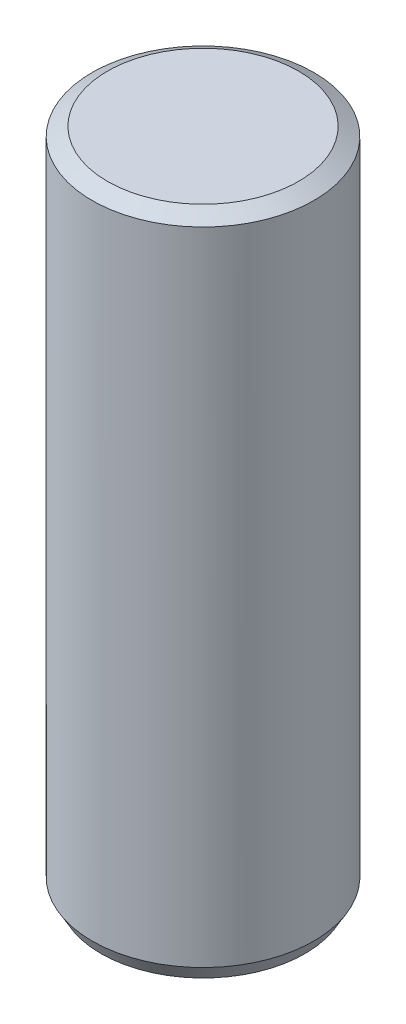
ISO-10303-21;
HEADER;
FILE_DESCRIPTION(('STEP AP214'),'2;1');
FILE_NAME('part.step','',(''),(''),'','','');
FILE_SCHEMA(('AUTOMOTIVE_DESIGN { 1 0 10303 214 1 1 1 1 }'));
ENDSEC;
DATA;
#1=APPLICATION_CONTEXT('core data for automotive mechanical design processes');
#2=APPLICATION_PROTOCOL_DEFINITION('international standard','automotive_design',2000,#1);
#3=PRODUCT_CONTEXT('',#1,'mechanical');
#4=PRODUCT('Part','Part','',(#3));
#5=PRODUCT_RELATED_PRODUCT_CATEGORY('part','',(#4));
#6=PRODUCT_DEFINITION_FORMATION('','',#4);
#7=PRODUCT_DEFINITION_CONTEXT('part definition',#1,'design');
#8=PRODUCT_DEFINITION('design','',#6,#7);
#9=PRODUCT_DEFINITION_SHAPE('','',#8);
#10=(LENGTH_UNIT() NAMED_UNIT(*) SI_UNIT(.MILLI.,.METRE.));
#11=(NAMED_UNIT(*) PLANE_ANGLE_UNIT() SI_UNIT($,.RADIAN.));
#12=(NAMED_UNIT(*) SI_UNIT($,.STERADIAN.) SOLID_ANGLE_UNIT());
#13=UNCERTAINTY_MEASURE_WITH_UNIT(LENGTH_MEASURE(1.E-05),#10,'distance_accuracy_value','');
#14=(GEOMETRIC_REPRESENTATION_CONTEXT(3) GLOBAL_UNCERTAINTY_ASSIGNED_CONTEXT((#13)) GLOBAL_UNIT_ASSIGNED_CONTEXT((#10,
#11,#12)) REPRESENTATION_CONTEXT('',''));
#15=CARTESIAN_POINT('',(0.,0.,0.));
#16=DIRECTION('',(0.,0.,1.));
#17=DIRECTION('',(1.,0.,0.));
#18=AXIS2_PLACEMENT_3D('',#15,#16,#17);
#19=CARTESIAN_POINT('',(0.,19.05,0.));
#20=DIRECTION('',(0.,-1.,0.));
#21=DIRECTION('',(0.,0.,-1.));
#22=AXIS2_PLACEMENT_3D('',#19,#20,#21);
#23=CYLINDRICAL_SURFACE('',#22,3.175);
#24=CARTESIAN_POINT('',(0.,0.439940905122515,0.));
#25=DIRECTION('',(0.,1.,0.));
#26=DIRECTION('',(0.,0.,1.));
#27=AXIS2_PLACEMENT_3D('',#24,#25,#26);
#28=CIRCLE('',#27,3.175);
#29=CARTESIAN_POINT('',(0.,0.439940905122511,-3.175));
#30=VERTEX_POINT('',#29);
#31=EDGE_CURVE('E41',#30,#30,#28,.T.);
#32=CARTESIAN_POINT('',(0.,18.796,0.));
#33=DIRECTION('',(0.,1.,0.));
#34=DIRECTION('',(0.,0.,1.));
#35=AXIS2_PLACEMENT_3D('',#32,#33,#34);
#36=CIRCLE('',#35,3.175);
#37=CARTESIAN_POINT('',(0.,18.796,-3.175));
#38=VERTEX_POINT('',#37);
#39=EDGE_CURVE('E45',#38,#38,#36,.F.);
#40=CARTESIAN_POINT('',(0.,0.439940905122511,-3.175));
#41=CARTESIAN_POINT('',(0.,0.631149854027485,-3.175));
#42=CARTESIAN_POINT('',(0.,0.822358802932459,-3.175));
#43=CARTESIAN_POINT('',(0.,1.20477670074241,-3.175));
#44=CARTESIAN_POINT('',(0.,1.39598564964738,-3.175));
#45=CARTESIAN_POINT('',(0.,1.77840354745733,-3.175));
#46=CARTESIAN_POINT('',(0.,1.9696124963623,-3.175));
#47=CARTESIAN_POINT('',(0.,2.35203039417225,-3.175));
#48=CARTESIAN_POINT('',(0.,2.54323934307723,-3.175));
#49=CARTESIAN_POINT('',(0.,2.92565724088717,-3.175));
#50=CARTESIAN_POINT('',(0.,3.11686618979215,-3.175));
#51=CARTESIAN_POINT('',(0.,3.49928408760209,-3.175));
#52=CARTESIAN_POINT('',(0.,3.69049303650707,-3.175));
#53=CARTESIAN_POINT('',(0.,4.07291093431701,-3.175));
#54=CARTESIAN_POINT('',(0.,4.26411988322199,-3.175));
#55=CARTESIAN_POINT('',(0.,4.64653778103194,-3.175));
#56=CARTESIAN_POINT('',(0.,4.83774672993691,-3.175));
#57=CARTESIAN_POINT('',(0.,5.22016462774686,-3.175));
#58=CARTESIAN_POINT('',(0.,5.41137357665183,-3.175));
#59=CARTESIAN_POINT('',(0.,5.79379147446178,-3.175));
#60=CARTESIAN_POINT('',(0.,5.98500042336675,-3.175));
#61=CARTESIAN_POINT('',(0.,6.3674183211767,-3.175));
#62=CARTESIAN_POINT('',(0.,6.55862727008167,-3.175));
#63=CARTESIAN_POINT('',(0.,6.94104516789162,-3.175));
#64=CARTESIAN_POINT('',(0.,7.1322541167966,-3.175));
#65=CARTESIAN_POINT('',(0.,7.51467201460654,-3.175));
#66=CARTESIAN_POINT('',(0.,7.70588096351152,-3.175));
#67=CARTESIAN_POINT('',(0.,8.08829886132147,-3.175));
#68=CARTESIAN_POINT('',(0.,8.27950781022644,-3.175));
#69=CARTESIAN_POINT('',(0.,8.66192570803639,-3.175));
#70=CARTESIAN_POINT('',(0.,8.85313465694136,-3.175));
#71=CARTESIAN_POINT('',(0.,9.23555255475131,-3.175));
#72=CARTESIAN_POINT('',(0.,9.42676150365628,-3.175));
#73=CARTESIAN_POINT('',(0.,9.80917940146623,-3.175));
#74=CARTESIAN_POINT('',(0.,10.0003883503712,-3.175));
#75=CARTESIAN_POINT('',(0.,10.3828062481812,-3.175));
#76=CARTESIAN_POINT('',(0.,10.5740151970861,-3.175));
#77=CARTESIAN_POINT('',(0.,10.9564330948961,-3.175));
#78=CARTESIAN_POINT('',(0.,11.147642043801,-3.175));
#79=CARTESIAN_POINT('',(0.,11.530059941611,-3.175));
#80=CARTESIAN_POINT('',(0.,11.721268890516,-3.175));
#81=CARTESIAN_POINT('',(0.,12.1036867883259,-3.175));
#82=CARTESIAN_POINT('',(0.,12.2948957372309,-3.175));
#83=CARTESIAN_POINT('',(0.,12.6773136350408,-3.175));
#84=CARTESIAN_POINT('',(0.,12.8685225839458,-3.175));
#85=CARTESIAN_POINT('',(0.,13.2509404817558,-3.175));
#86=CARTESIAN_POINT('',(0.,13.4421494306607,-3.175));
#87=CARTESIAN_POINT('',(0.,13.8245673284707,-3.175));
#88=CARTESIAN_POINT('',(0.,14.0157762773757,-3.175));
#89=CARTESIAN_POINT('',(0.,14.3981941751856,-3.175));
#90=CARTESIAN_POINT('',(0.,14.5894031240906,-3.175));
#91=CARTESIAN_POINT('',(0.,14.9718210219005,-3.175));
#92=CARTESIAN_POINT('',(0.,15.1630299708055,-3.175));
#93=CARTESIAN_POINT('',(0.,15.5454478686154,-3.175));
#94=CARTESIAN_POINT('',(0.,15.7366568175204,-3.175));
#95=CARTESIAN_POINT('',(0.,16.1190747153304,-3.175));
#96=CARTESIAN_POINT('',(0.,16.3102836642353,-3.175));
#97=CARTESIAN_POINT('',(0.,16.6927015620453,-3.175));
#98=CARTESIAN_POINT('',(0.,16.8839105109503,-3.175));
#99=CARTESIAN_POINT('',(0.,17.2663284087602,-3.175));
#100=CARTESIAN_POINT('',(0.,17.4575373576652,-3.175));
#101=CARTESIAN_POINT('',(0.,17.8399552554751,-3.175));
#102=CARTESIAN_POINT('',(0.,18.0311642043801,-3.175));
#103=CARTESIAN_POINT('',(0.,18.4135821021901,-3.175));
#104=CARTESIAN_POINT('',(0.,18.604791051095,-3.175));
#105=CARTESIAN_POINT('',(0.,18.796,-3.175));
#106=B_SPLINE_CURVE_WITH_KNOTS('',3,(#40,#41,#42,#43,#44,#45,#46,#47,#48,#49,#50,#51,#52,#53,
#54,#55,#56,#57,#58,#59,#60,#61,#62,#63,#64,#65,#66,#67,#68,#69,#70,#71,#72,#73,#74,#75,#76,#77,
#78,#79,#80,#81,#82,#83,#84,#85,#86,#87,#88,#89,#90,#91,#92,#93,#94,#95,#96,#97,#98,#99,#100,
#101,#102,#103,#104,#105),.UNSPECIFIED.,.F.,.F.,(4,2,2,2,2,2,2,2,2,2,2,2,2,2,2,2,2,2,2,2,2,2,2,
2,2,2,2,2,2,2,2,2,4),(0.,0.573626846714921,1.14725369342984,1.72088054014477,2.29450738685969,
2.86813423357461,3.44176108028953,4.01538792700445,4.58901477371937,5.16264162043429,
5.73626846714922,6.30989531386414,6.88352216057906,7.45714900729398,8.0307758540089,
8.60440270072382,9.17802954743875,9.75165639415367,10.3252832408686,10.8989100875835,
11.4725369342984,12.0461637810134,12.6197906277283,13.1934174744432,13.7670443211581,
14.340671167873,14.914298014588,15.4879248613029,16.0615517080178,16.6351785547327,
17.2088054014476,17.7824322481626,18.3560590948775),.UNSPECIFIED.);
#107=EDGE_CURVE('BSEAM30',#30,#38,#106,.T.);
#108=ORIENTED_EDGE('',*,*,#31,.T.);
#109=ORIENTED_EDGE('',*,*,#39,.T.);
#110=ORIENTED_EDGE('',*,*,#107,.T.);
#111=ORIENTED_EDGE('',*,*,#107,.F.);
#112=EDGE_LOOP('',(#108,#110,#109,#111));
#113=FACE_BOUND('',#112,.T.);
#114=ADVANCED_FACE('F30',(#113),#23,.T.);
#115=CARTESIAN_POINT('',(0.,19.05,0.));
#116=DIRECTION('',(0.,1.,0.));
#117=DIRECTION('',(0.,0.,1.));
#118=AXIS2_PLACEMENT_3D('',#115,#116,#117);
#119=PLANE('',#118);
#120=CARTESIAN_POINT('',(0.,19.05,0.));
#121=DIRECTION('',(0.,1.,0.));
#122=DIRECTION('',(0.,0.,1.));
#123=AXIS2_PLACEMENT_3D('',#120,#121,#122);
#124=CIRCLE('',#123,2.73505909487751);
#125=CARTESIAN_POINT('',(0.,19.05,2.73505909487751));
#126=VERTEX_POINT('',#125);
#127=EDGE_CURVE('E10',#126,#126,#124,.T.);
#128=ORIENTED_EDGE('',*,*,#127,.T.);
#129=EDGE_LOOP('',(#128));
#130=FACE_BOUND('',#129,.T.);
#131=ADVANCED_FACE('F61',(#130),#119,.T.);
#132=CARTESIAN_POINT('',(0.,0.,0.));
#133=DIRECTION('',(0.,1.,0.));
#134=DIRECTION('',(0.,0.,1.));
#135=AXIS2_PLACEMENT_3D('',#132,#133,#134);
#136=PLANE('',#135);
#137=CARTESIAN_POINT('',(0.,0.,0.));
#138=DIRECTION('',(0.,1.,0.));
#139=DIRECTION('',(0.,0.,1.));
#140=AXIS2_PLACEMENT_3D('',#137,#138,#139);
#141=CIRCLE('',#140,2.92099999999999);
#142=CARTESIAN_POINT('',(0.,0.,2.92099999999999));
#143=VERTEX_POINT('',#142);
#144=EDGE_CURVE('E37',#143,#143,#141,.F.);
#145=ORIENTED_EDGE('',*,*,#144,.T.);
#146=EDGE_LOOP('',(#145));
#147=FACE_BOUND('',#146,.T.);
#148=ADVANCED_FACE('F58',(#147),#136,.F.);
#149=CARTESIAN_POINT('',(0.,0.439940905122515,0.));
#150=DIRECTION('',(0.,1.,0.));
#151=DIRECTION('',(0.,0.,1.));
#152=AXIS2_PLACEMENT_3D('',#149,#150,#151);
#153=CONICAL_SURFACE('',#152,3.175,0.523598775598303);
#154=ORIENTED_EDGE('',*,*,#144,.F.);
#155=EDGE_LOOP('',(#154));
#156=FACE_BOUND('',#155,.T.);
#157=ORIENTED_EDGE('',*,*,#31,.F.);
#158=EDGE_LOOP('',(#157));
#159=FACE_BOUND('',#158,.T.);
#160=ADVANCED_FACE('F54',(#156,#159),#153,.T.);
#161=CARTESIAN_POINT('',(0.,19.05,0.));
#162=DIRECTION('',(0.,-1.,0.));
#163=DIRECTION('',(0.,0.,-1.));
#164=AXIS2_PLACEMENT_3D('',#161,#162,#163);
#165=CONICAL_SURFACE('',#164,2.73505909487751,1.04719755119659);
#166=ORIENTED_EDGE('',*,*,#39,.F.);
#167=EDGE_LOOP('',(#166));
#168=FACE_BOUND('',#167,.T.);
#169=ORIENTED_EDGE('',*,*,#127,.F.);
#170=EDGE_LOOP('',(#169));
#171=FACE_BOUND('',#170,.T.);
#172=ADVANCED_FACE('F32',(#168,#171),#165,.T.);
#173=CLOSED_SHELL('',(#114,#131,#148,#160,#172));
#174=MANIFOLD_SOLID_BREP('B2',#173);
#175=ADVANCED_BREP_SHAPE_REPRESENTATION('',(#18,#174),#14);
#176=SHAPE_DEFINITION_REPRESENTATION(#9,#175);
ENDSEC;
END-ISO-10303-21;
